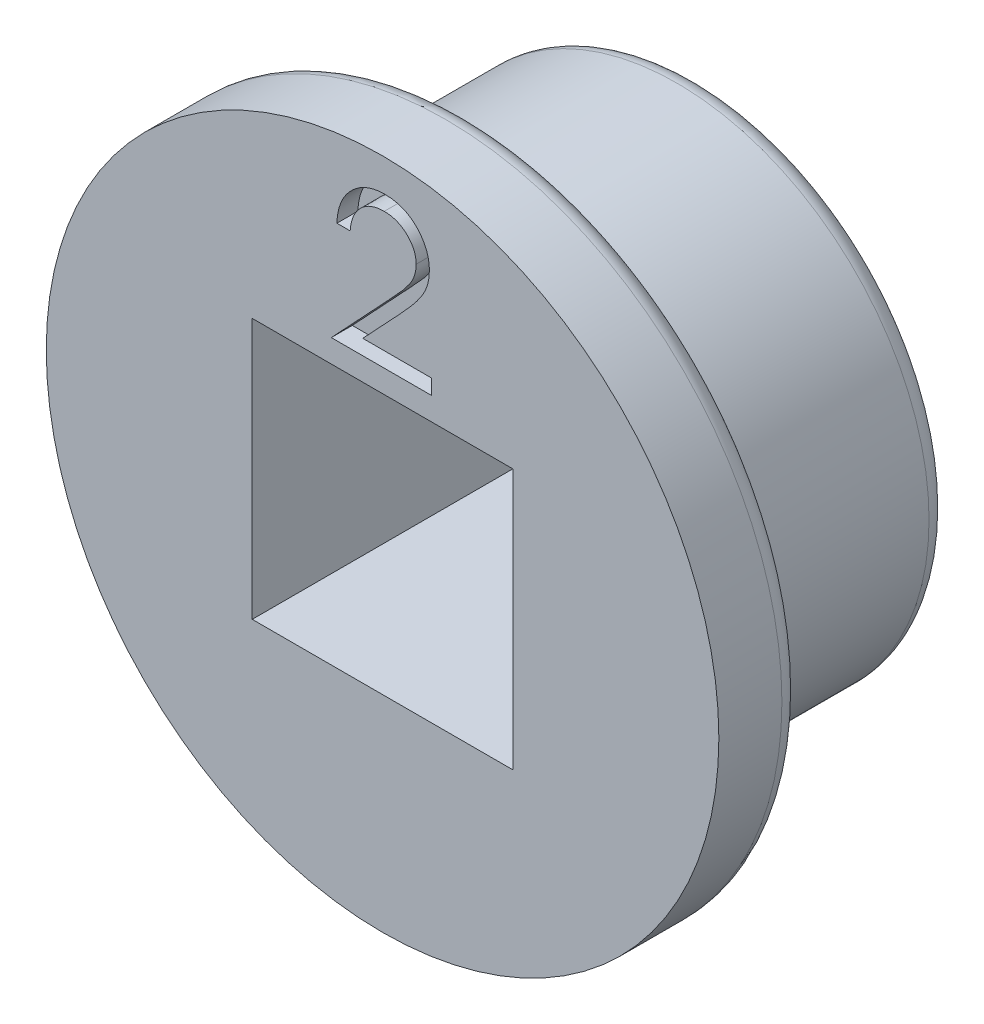
ISO-10303-21;
HEADER;
FILE_DESCRIPTION(('STEP AP214'),'2;1');
FILE_NAME('part.step','',(''),(''),'','','');
FILE_SCHEMA(('AUTOMOTIVE_DESIGN { 1 0 10303 214 1 1 1 1 }'));
ENDSEC;
DATA;
#1=APPLICATION_CONTEXT('core data for automotive mechanical design processes');
#2=APPLICATION_PROTOCOL_DEFINITION('international standard','automotive_design',2000,#1);
#3=PRODUCT_CONTEXT('',#1,'mechanical');
#4=PRODUCT('Part','Part','',(#3));
#5=PRODUCT_RELATED_PRODUCT_CATEGORY('part','',(#4));
#6=PRODUCT_DEFINITION_FORMATION('','',#4);
#7=PRODUCT_DEFINITION_CONTEXT('part definition',#1,'design');
#8=PRODUCT_DEFINITION('design','',#6,#7);
#9=PRODUCT_DEFINITION_SHAPE('','',#8);
#10=(LENGTH_UNIT() NAMED_UNIT(*) SI_UNIT(.MILLI.,.METRE.));
#11=(NAMED_UNIT(*) PLANE_ANGLE_UNIT() SI_UNIT($,.RADIAN.));
#12=(NAMED_UNIT(*) SI_UNIT($,.STERADIAN.) SOLID_ANGLE_UNIT());
#13=UNCERTAINTY_MEASURE_WITH_UNIT(LENGTH_MEASURE(1.E-05),#10,'distance_accuracy_value','');
#14=(GEOMETRIC_REPRESENTATION_CONTEXT(3) GLOBAL_UNCERTAINTY_ASSIGNED_CONTEXT((#13)) GLOBAL_UNIT_ASSIGNED_CONTEXT((#10,
#11,#12)) REPRESENTATION_CONTEXT('',''));
#15=CARTESIAN_POINT('',(0.,0.,0.));
#16=DIRECTION('',(0.,0.,1.));
#17=DIRECTION('',(1.,0.,0.));
#18=AXIS2_PLACEMENT_3D('',#15,#16,#17);
#19=CARTESIAN_POINT('',(0.,0.,2.));
#20=DIRECTION('',(0.,0.,1.));
#21=DIRECTION('',(1.,0.,0.));
#22=AXIS2_PLACEMENT_3D('',#19,#20,#21);
#23=PLANE('',#22);
#24=CARTESIAN_POINT('',(0.,0.,2.));
#25=DIRECTION('',(0.,0.,1.));
#26=DIRECTION('',(1.,0.,0.));
#27=AXIS2_PLACEMENT_3D('',#24,#25,#26);
#28=CIRCLE('',#27,8.);
#29=CARTESIAN_POINT('',(8.,0.,2.));
#30=VERTEX_POINT('',#29);
#31=EDGE_CURVE('E180',#30,#30,#28,.T.);
#32=ORIENTED_EDGE('',*,*,#31,.T.);
#33=EDGE_LOOP('',(#32));
#34=FACE_BOUND('',#33,.T.);
#35=DIRECTION('',(1.,0.,0.));
#36=VECTOR('',#35,1.);
#37=CARTESIAN_POINT('',(0.,3.1,2.));
#38=LINE('',#37,#36);
#39=CARTESIAN_POINT('',(-3.1,3.1,2.));
#40=VERTEX_POINT('',#39);
#41=CARTESIAN_POINT('',(3.1,3.1,2.));
#42=VERTEX_POINT('',#41);
#43=EDGE_CURVE('E186',#40,#42,#38,.T.);
#44=ORIENTED_EDGE('',*,*,#43,.T.);
#45=DIRECTION('',(0.,-1.,0.));
#46=VECTOR('',#45,1.);
#47=CARTESIAN_POINT('',(3.1,0.,2.));
#48=LINE('',#47,#46);
#49=CARTESIAN_POINT('',(3.1,-3.1,2.));
#50=VERTEX_POINT('',#49);
#51=EDGE_CURVE('E195',#42,#50,#48,.T.);
#52=ORIENTED_EDGE('',*,*,#51,.T.);
#53=DIRECTION('',(1.,0.,0.));
#54=VECTOR('',#53,1.);
#55=CARTESIAN_POINT('',(0.,-3.1,2.));
#56=LINE('',#55,#54);
#57=CARTESIAN_POINT('',(-3.1,-3.1,2.));
#58=VERTEX_POINT('',#57);
#59=EDGE_CURVE('E199',#58,#50,#56,.T.);
#60=ORIENTED_EDGE('',*,*,#59,.F.);
#61=DIRECTION('',(0.,-1.,0.));
#62=VECTOR('',#61,1.);
#63=CARTESIAN_POINT('',(-3.1,0.,2.));
#64=LINE('',#63,#62);
#65=EDGE_CURVE('E203',#40,#58,#64,.T.);
#66=ORIENTED_EDGE('',*,*,#65,.F.);
#67=EDGE_LOOP('',(#44,#52,#60,#66));
#68=FACE_BOUND('',#67,.T.);
#69=CARTESIAN_POINT('',(0.799536119088481,6.16609445920682,2.));
#70=CARTESIAN_POINT('',(0.798900376789061,6.18997585761763,2.));
#71=CARTESIAN_POINT('',(0.797647450797474,6.23704150797893,2.));
#72=CARTESIAN_POINT('',(0.786589753303671,6.30604726699755,2.));
#73=CARTESIAN_POINT('',(0.769879247209163,6.37261208081334,2.));
#74=CARTESIAN_POINT('',(0.74593398916123,6.43694069993118,2.));
#75=CARTESIAN_POINT('',(0.71432724907589,6.49838635199736,2.));
#76=CARTESIAN_POINT('',(0.675853869158293,6.55702383220096,2.));
#77=CARTESIAN_POINT('',(0.631463805740429,6.61371279740104,2.));
#78=CARTESIAN_POINT('',(0.58011253640956,6.66686609545911,2.));
#79=CARTESIAN_POINT('',(0.523701016602978,6.71554730094158,2.));
#80=CARTESIAN_POINT('',(0.464106767017747,6.75867138635594,2.));
#81=CARTESIAN_POINT('',(0.401056662757836,6.79471049715476,2.));
#82=CARTESIAN_POINT('',(0.334816540582015,6.82425399433519,2.));
#83=CARTESIAN_POINT('',(0.26557107117366,6.84742937553153,2.));
#84=CARTESIAN_POINT('',(0.193186326051267,6.86348795495464,2.));
#85=CARTESIAN_POINT('',(0.117862309768765,6.87357043890127,2.));
#86=CARTESIAN_POINT('',(0.0664288140781253,6.87493461080964,2.));
#87=CARTESIAN_POINT('',(0.0402212152423268,6.87562971561707,2.));
#88=B_SPLINE_CURVE_WITH_KNOTS('',3,(#69,#70,#71,#72,#73,#74,#75,#76,#77,#78,#79,#80,#81,#82,#83,
#84,#85,#86,#87),.UNSPECIFIED.,.F.,.F.,(4,1,1,1,1,1,1,1,1,1,1,1,1,1,1,1,4),(0.,
0.0619654006870618,0.122121905638295,0.180988496849841,0.239933216451902,0.299905831106524,
0.359988847476987,0.421775741741646,0.486575826421126,0.551534804619741,0.615017542759979,
0.677258616661657,0.739729962362713,0.803050102662951,0.866495132015698,0.931973474177149,1.),.UNSPECIFIED.);
#89=CARTESIAN_POINT('',(0.79953611908848,6.16609445920682,2.));
#90=VERTEX_POINT('',#89);
#91=CARTESIAN_POINT('',(0.0402212152423268,6.87562971561707,2.));
#92=VERTEX_POINT('',#91);
#93=EDGE_CURVE('E174',#90,#92,#88,.T.);
#94=ORIENTED_EDGE('',*,*,#93,.T.);
#95=CARTESIAN_POINT('',(0.0402212152423268,6.87562971561707,2.));
#96=CARTESIAN_POINT('',(0.0128503824860018,6.87491468335314,2.));
#97=CARTESIAN_POINT('',(-0.0409014137335572,6.87351047804878,2.));
#98=CARTESIAN_POINT('',(-0.119820446670097,6.86368781405675,2.));
#99=CARTESIAN_POINT('',(-0.195106224193959,6.84674197365982,2.));
#100=CARTESIAN_POINT('',(-0.266948127146877,6.8235652992728,2.));
#101=CARTESIAN_POINT('',(-0.335467712959603,6.79410675045047,2.));
#102=CARTESIAN_POINT('',(-0.400331756996927,6.7574150057717,2.));
#103=CARTESIAN_POINT('',(-0.461394646256844,6.71363151261916,2.));
#104=CARTESIAN_POINT('',(-0.518771169602337,6.66399095629512,2.));
#105=CARTESIAN_POINT('',(-0.571635148665881,6.60872335507919,2.));
#106=CARTESIAN_POINT('',(-0.618082024530801,6.54711339201225,2.));
#107=CARTESIAN_POINT('',(-0.658666038674432,6.48028597664115,2.));
#108=CARTESIAN_POINT('',(-0.694075272154231,6.4084214260718,2.));
#109=CARTESIAN_POINT('',(-0.722830962237,6.33086764608729,2.));
#110=CARTESIAN_POINT('',(-0.744804112668102,6.24789994123884,2.));
#111=CARTESIAN_POINT('',(-0.762190959389715,6.15987855980029,2.));
#112=CARTESIAN_POINT('',(-0.767999479994565,6.09909347494372,2.));
#113=CARTESIAN_POINT('',(-0.77097670142434,6.06793740792477,2.));
#114=B_SPLINE_CURVE_WITH_KNOTS('',3,(#95,#96,#97,#98,#99,#100,#101,#102,#103,#104,#105,#106,
#107,#108,#109,#110,#111,#112,#113),.UNSPECIFIED.,.F.,.F.,(4,1,1,1,1,1,1,1,1,1,1,1,1,1,1,1,4),
(0.,0.0644386715952429,0.126546911271678,0.186887153436571,0.245877535589455,0.304040884691267,
0.362191218072661,0.420975932791645,0.480660283279666,0.540600274953758,0.600689098349453,
0.661935789757196,0.724442505913982,0.789038393881744,0.856313757050995,0.926352028205864,1.),.UNSPECIFIED.);
#115=CARTESIAN_POINT('',(-0.77097670142434,6.06793740792477,2.));
#116=VERTEX_POINT('',#115);
#117=EDGE_CURVE('E57',#92,#116,#114,.T.);
#118=ORIENTED_EDGE('',*,*,#117,.T.);
#119=DIRECTION('',(-1.,0.,0.));
#120=VECTOR('',#119,1.);
#121=CARTESIAN_POINT('',(-0.77097670142434,6.06793740792477,2.));
#122=LINE('',#121,#120);
#123=CARTESIAN_POINT('',(-1.0850792655269,6.06793740792477,2.));
#124=VERTEX_POINT('',#123);
#125=EDGE_CURVE('E178',#116,#124,#122,.T.);
#126=ORIENTED_EDGE('',*,*,#125,.T.);
#127=CARTESIAN_POINT('',(-1.0850792655269,6.06793740792477,2.));
#128=CARTESIAN_POINT('',(-1.08303211251897,6.10960829569256,2.));
#129=CARTESIAN_POINT('',(-1.07901155849296,6.19144881026746,2.));
#130=CARTESIAN_POINT('',(-1.06018326923122,6.31077271666656,2.));
#131=CARTESIAN_POINT('',(-1.03324239202635,6.42482751539142,2.));
#132=CARTESIAN_POINT('',(-0.995150938011544,6.53269742936108,2.));
#133=CARTESIAN_POINT('',(-0.947844660241776,6.6353362365914,2.));
#134=CARTESIAN_POINT('',(-0.891114632860886,6.73233625228268,2.));
#135=CARTESIAN_POINT('',(-0.823920782347463,6.82332744099729,2.));
#136=CARTESIAN_POINT('',(-0.747714048302034,6.90746628429275,2.));
#137=CARTESIAN_POINT('',(-0.664945409247032,6.98465385509209,2.));
#138=CARTESIAN_POINT('',(-0.575639469775992,7.05130909789825,2.));
#139=CARTESIAN_POINT('',(-0.481794442489688,7.10762676926023,2.));
#140=CARTESIAN_POINT('',(-0.383695043524293,7.15470801108408,2.));
#141=CARTESIAN_POINT('',(-0.28023447996484,7.19004785700661,2.));
#142=CARTESIAN_POINT('',(-0.172351622125396,7.2162694966112,2.));
#143=CARTESIAN_POINT('',(-0.0595724857159585,7.23204584233277,2.));
#144=CARTESIAN_POINT('',(0.0172675363309748,7.23374162793707,2.));
#145=CARTESIAN_POINT('',(0.056347016524378,7.23460407459143,2.));
#146=B_SPLINE_CURVE_WITH_KNOTS('',3,(#127,#128,#129,#130,#131,#132,#133,#134,#135,#136,#137,
#138,#139,#140,#141,#142,#143,#144,#145),.UNSPECIFIED.,.F.,.F.,(4,1,1,1,1,1,1,1,1,1,1,1,1,1,1,1,
4),(0.,0.0687907943906179,0.135103289431127,0.198978674310651,0.261904299780856,
0.323494969367969,0.385195377966051,0.446969238740774,0.509764776703132,0.572250568847368,
0.633405175661153,0.693251162921753,0.75258316278567,0.812579266153421,0.873275084920192,
0.935549942895029,1.),.UNSPECIFIED.);
#147=CARTESIAN_POINT('',(0.056347016524378,7.23460407459143,2.));
#148=VERTEX_POINT('',#147);
#149=EDGE_CURVE('E362',#124,#148,#146,.T.);
#150=ORIENTED_EDGE('',*,*,#149,.T.);
#151=CARTESIAN_POINT('',(0.056347016524378,7.23460407459143,2.));
#152=CARTESIAN_POINT('',(0.094725090611721,7.233705618146,2.));
#153=CARTESIAN_POINT('',(0.170136635268132,7.23194018332502,2.));
#154=CARTESIAN_POINT('',(0.280198649721017,7.21677915405779,2.));
#155=CARTESIAN_POINT('',(0.384975944184401,7.1930335624225,2.));
#156=CARTESIAN_POINT('',(0.484263710706301,7.1597181461092,2.));
#157=CARTESIAN_POINT('',(0.577269775277551,7.11493371871667,2.));
#158=CARTESIAN_POINT('',(0.664692819833899,7.06113618005852,2.));
#159=CARTESIAN_POINT('',(0.7475736306249,6.99891634868636,2.));
#160=CARTESIAN_POINT('',(0.822180414237061,6.92566253523797,2.));
#161=CARTESIAN_POINT('',(0.890688493473317,6.8474601507676,2.));
#162=CARTESIAN_POINT('',(0.949790748617592,6.76397224715545,2.));
#163=CARTESIAN_POINT('',(1.00040391209092,6.67774296144043,2.));
#164=CARTESIAN_POINT('',(1.0425915919721,6.58811475985893,2.));
#165=CARTESIAN_POINT('',(1.07364773091123,6.49424373144623,2.));
#166=CARTESIAN_POINT('',(1.0972259389406,6.39749652865459,2.));
#167=CARTESIAN_POINT('',(1.11055335262869,6.29687171764802,2.));
#168=CARTESIAN_POINT('',(1.11259877612654,6.22876516200028,2.));
#169=CARTESIAN_POINT('',(1.11363868319104,6.19413933100169,2.));
#170=B_SPLINE_CURVE_WITH_KNOTS('',3,(#151,#152,#153,#154,#155,#156,#157,#158,#159,#160,#161,
#162,#163,#164,#165,#166,#167,#168,#169),.UNSPECIFIED.,.F.,.F.,(4,1,1,1,1,1,1,1,1,1,1,1,1,1,1,1,
4),(0.,0.0694754602496704,0.136516797617799,0.200788823609261,0.263829672855826,
0.32573502296542,0.387290692215291,0.449509218762603,0.512967819545442,0.576275215493061,
0.637580100263925,0.697902605917102,0.757172088426985,0.816598528488656,0.87665317089282,
0.937289642410241,1.),.UNSPECIFIED.);
#171=CARTESIAN_POINT('',(1.11363868319104,6.19413933100169,2.));
#172=VERTEX_POINT('',#171);
#173=EDGE_CURVE('E365',#148,#172,#170,.T.);
#174=ORIENTED_EDGE('',*,*,#173,.T.);
#175=CARTESIAN_POINT('',(1.11363868319104,6.19413933100169,2.));
#176=CARTESIAN_POINT('',(1.11194542033456,6.14539149642686,2.));
#177=CARTESIAN_POINT('',(1.10858860898739,6.04875128275634,2.));
#178=CARTESIAN_POINT('',(1.07987423241998,5.90673642000715,2.));
#179=CARTESIAN_POINT('',(1.03502772132452,5.76914300092048,2.));
#180=CARTESIAN_POINT('',(0.981030364475177,5.65840569883603,2.));
#181=CARTESIAN_POINT('',(0.926557920413495,5.569172205079,2.));
#182=CARTESIAN_POINT('',(0.877470412819851,5.49570350015926,2.));
#183=CARTESIAN_POINT('',(0.820005601798043,5.41659803176986,2.));
#184=CARTESIAN_POINT('',(0.753327103835355,5.33212069439591,2.));
#185=CARTESIAN_POINT('',(0.678814231684619,5.24160978929735,2.));
#186=CARTESIAN_POINT('',(0.595792068327983,5.14511999389894,2.));
#187=CARTESIAN_POINT('',(0.503668586306585,5.04364822407889,2.));
#188=CARTESIAN_POINT('',(0.439010085552245,4.97434262269106,2.));
#189=CARTESIAN_POINT('',(0.405505670370532,4.9384301963863,2.));
#190=B_SPLINE_CURVE_WITH_KNOTS('',3,(#175,#176,#177,#178,#179,#180,#181,#182,#183,#184,#185,
#186,#187,#188,#189),.UNSPECIFIED.,.F.,.F.,(4,1,1,1,1,1,1,1,1,1,1,1,4),(0.,0.0987021963061532,
0.195672308810664,0.292422426507954,0.391342543799825,0.444462440671892,0.504228775449316,
0.570352337994678,0.642545753097748,0.722287505344019,0.807921122682712,0.900469537985015,1.),.UNSPECIFIED.);
#191=CARTESIAN_POINT('',(0.405505670370532,4.9384301963863,2.));
#192=VERTEX_POINT('',#191);
#193=EDGE_CURVE('E371',#172,#192,#190,.T.);
#194=ORIENTED_EDGE('',*,*,#193,.T.);
#195=DIRECTION('',(-0.683740795861405,-0.729724964678345,0.));
#196=VECTOR('',#195,1.);
#197=CARTESIAN_POINT('',(0.405505670370532,4.9384301963863,2.));
#198=LINE('',#197,#196);
#199=CARTESIAN_POINT('',(-0.47019545142434,4.0038348438222,2.));
#200=VERTEX_POINT('',#199);
#201=EDGE_CURVE('E393',#192,#200,#198,.T.);
#202=ORIENTED_EDGE('',*,*,#201,.T.);
#203=DIRECTION('',(1.,0.,0.));
#204=VECTOR('',#203,1.);
#205=CARTESIAN_POINT('',(-0.47019545142434,4.0038348438222,2.));
#206=LINE('',#205,#204);
#207=CARTESIAN_POINT('',(1.15851047806284,4.0038348438222,2.));
#208=VERTEX_POINT('',#207);
#209=EDGE_CURVE('E400',#200,#208,#206,.T.);
#210=ORIENTED_EDGE('',*,*,#209,.T.);
#211=DIRECTION('',(0.,-1.,0.));
#212=VECTOR('',#211,1.);
#213=CARTESIAN_POINT('',(1.15851047806284,4.0038348438222,2.));
#214=LINE('',#213,#212);
#215=CARTESIAN_POINT('',(1.15851047806284,3.64486048484784,2.));
#216=VERTEX_POINT('',#215);
#217=EDGE_CURVE('E404',#208,#216,#214,.T.);
#218=ORIENTED_EDGE('',*,*,#217,.T.);
#219=DIRECTION('',(-1.,0.,0.));
#220=VECTOR('',#219,1.);
#221=CARTESIAN_POINT('',(1.15851047806284,3.64486048484784,2.));
#222=LINE('',#221,#220);
#223=CARTESIAN_POINT('',(-1.21969465014229,3.64486048484784,2.));
#224=VERTEX_POINT('',#223);
#225=EDGE_CURVE('E408',#216,#224,#222,.T.);
#226=ORIENTED_EDGE('',*,*,#225,.T.);
#227=DIRECTION('',(0.683776631973393,0.729691385153424,0.));
#228=VECTOR('',#227,1.);
#229=CARTESIAN_POINT('',(-1.21969465014229,3.64486048484784,2.));
#230=LINE('',#229,#228);
#231=CARTESIAN_POINT('',(0.137677144729506,5.09337811305297,2.));
#232=VERTEX_POINT('',#231);
#233=EDGE_CURVE('E318',#224,#232,#230,.T.);
#234=ORIENTED_EDGE('',*,*,#233,.T.);
#235=CARTESIAN_POINT('',(0.137677144729506,5.09337811305297,2.));
#236=CARTESIAN_POINT('',(0.170725031537361,5.12787641960158,2.));
#237=CARTESIAN_POINT('',(0.234203258656264,5.19414060620578,2.));
#238=CARTESIAN_POINT('',(0.323985835465464,5.2908835663398,2.));
#239=CARTESIAN_POINT('',(0.404624823777869,5.38063310709192,2.));
#240=CARTESIAN_POINT('',(0.476642216549692,5.4632196555364,2.));
#241=CARTESIAN_POINT('',(0.538475721915515,5.53985122333192,2.));
#242=CARTESIAN_POINT('',(0.593347953863292,5.60804592691967,2.));
#243=CARTESIAN_POINT('',(0.637313544845364,5.67080037722758,2.));
#244=CARTESIAN_POINT('',(0.685028940533035,5.74354099114011,2.));
#245=CARTESIAN_POINT('',(0.731242921931261,5.83235330831417,2.));
#246=CARTESIAN_POINT('',(0.770955277971654,5.94088699757521,2.));
#247=CARTESIAN_POINT('',(0.795170126420277,6.0526142502512,2.));
#248=CARTESIAN_POINT('',(0.798074961926103,6.12811628729847,2.));
#249=CARTESIAN_POINT('',(0.79953611908848,6.16609445920682,2.));
#250=B_SPLINE_CURVE_WITH_KNOTS('',3,(#235,#236,#237,#238,#239,#240,#241,#242,#243,#244,#245,
#246,#247,#248,#249),.UNSPECIFIED.,.F.,.F.,(4,1,1,1,1,1,1,1,1,1,1,1,4),(0.,0.110802643801319,
0.21282920234777,0.306101309823111,0.39064732111601,0.466924469360852,0.534481039284031,
0.593586940965672,0.644557004508717,0.736200452629373,0.825024025618864,0.911985584829758,1.),.UNSPECIFIED.);
#251=EDGE_CURVE('E312',#232,#90,#250,.T.);
#252=ORIENTED_EDGE('',*,*,#251,.T.);
#253=EDGE_LOOP('',(#94,#118,#126,#150,#174,#194,#202,#210,#218,#226,#234,#252));
#254=FACE_BOUND('',#253,.T.);
#255=ADVANCED_FACE('F41',(#34,#68,#254),#23,.T.);
#256=CARTESIAN_POINT('',(0.,3.1,-5.5));
#257=DIRECTION('',(0.,-1.,0.));
#258=DIRECTION('',(0.,0.,-1.));
#259=AXIS2_PLACEMENT_3D('',#256,#257,#258);
#260=PLANE('',#259);
#261=DIRECTION('',(0.,0.,1.));
#262=VECTOR('',#261,1.);
#263=CARTESIAN_POINT('',(3.1,3.1,-5.5));
#264=LINE('',#263,#262);
#265=CARTESIAN_POINT('',(3.1,3.1,-5.5));
#266=VERTEX_POINT('',#265);
#267=EDGE_CURVE('E221',#266,#42,#264,.T.);
#268=ORIENTED_EDGE('',*,*,#267,.T.);
#269=ORIENTED_EDGE('',*,*,#43,.F.);
#270=DIRECTION('',(0.,0.,1.));
#271=VECTOR('',#270,1.);
#272=CARTESIAN_POINT('',(-3.1,3.1,-5.5));
#273=LINE('',#272,#271);
#274=CARTESIAN_POINT('',(-3.1,3.1,-5.5));
#275=VERTEX_POINT('',#274);
#276=EDGE_CURVE('E65',#275,#40,#273,.T.);
#277=ORIENTED_EDGE('',*,*,#276,.F.);
#278=DIRECTION('',(1.,0.,0.));
#279=VECTOR('',#278,1.);
#280=CARTESIAN_POINT('',(0.,3.1,-5.5));
#281=LINE('',#280,#279);
#282=EDGE_CURVE('E208',#275,#266,#281,.T.);
#283=ORIENTED_EDGE('',*,*,#282,.T.);
#284=EDGE_LOOP('',(#268,#269,#277,#283));
#285=FACE_BOUND('',#284,.T.);
#286=ADVANCED_FACE('F261',(#285),#260,.T.);
#287=CARTESIAN_POINT('',(-3.1,0.,-5.5));
#288=DIRECTION('',(-1.,0.,0.));
#289=DIRECTION('',(0.,0.,1.));
#290=AXIS2_PLACEMENT_3D('',#287,#288,#289);
#291=PLANE('',#290);
#292=ORIENTED_EDGE('',*,*,#276,.T.);
#293=ORIENTED_EDGE('',*,*,#65,.T.);
#294=DIRECTION('',(0.,0.,1.));
#295=VECTOR('',#294,1.);
#296=CARTESIAN_POINT('',(-3.1,-3.1,-5.5));
#297=LINE('',#296,#295);
#298=CARTESIAN_POINT('',(-3.1,-3.1,-5.5));
#299=VERTEX_POINT('',#298);
#300=EDGE_CURVE('E228',#299,#58,#297,.T.);
#301=ORIENTED_EDGE('',*,*,#300,.F.);
#302=DIRECTION('',(0.,-1.,0.));
#303=VECTOR('',#302,1.);
#304=CARTESIAN_POINT('',(-3.1,0.,-5.5));
#305=LINE('',#304,#303);
#306=EDGE_CURVE('E218',#275,#299,#305,.T.);
#307=ORIENTED_EDGE('',*,*,#306,.F.);
#308=EDGE_LOOP('',(#292,#293,#301,#307));
#309=FACE_BOUND('',#308,.T.);
#310=ADVANCED_FACE('F267',(#309),#291,.F.);
#311=CARTESIAN_POINT('',(0.,-3.1,-5.5));
#312=DIRECTION('',(0.,-1.,0.));
#313=DIRECTION('',(0.,0.,-1.));
#314=AXIS2_PLACEMENT_3D('',#311,#312,#313);
#315=PLANE('',#314);
#316=ORIENTED_EDGE('',*,*,#300,.T.);
#317=ORIENTED_EDGE('',*,*,#59,.T.);
#318=DIRECTION('',(0.,0.,1.));
#319=VECTOR('',#318,1.);
#320=CARTESIAN_POINT('',(3.1,-3.1,-5.5));
#321=LINE('',#320,#319);
#322=CARTESIAN_POINT('',(3.1,-3.1,-5.5));
#323=VERTEX_POINT('',#322);
#324=EDGE_CURVE('E231',#323,#50,#321,.T.);
#325=ORIENTED_EDGE('',*,*,#324,.F.);
#326=DIRECTION('',(1.,0.,0.));
#327=VECTOR('',#326,1.);
#328=CARTESIAN_POINT('',(0.,-3.1,-5.5));
#329=LINE('',#328,#327);
#330=EDGE_CURVE('E215',#299,#323,#329,.T.);
#331=ORIENTED_EDGE('',*,*,#330,.F.);
#332=EDGE_LOOP('',(#316,#317,#325,#331));
#333=FACE_BOUND('',#332,.T.);
#334=ADVANCED_FACE('F288',(#333),#315,.F.);
#335=CARTESIAN_POINT('',(3.1,0.,-5.5));
#336=DIRECTION('',(-1.,0.,0.));
#337=DIRECTION('',(0.,0.,1.));
#338=AXIS2_PLACEMENT_3D('',#335,#336,#337);
#339=PLANE('',#338);
#340=ORIENTED_EDGE('',*,*,#324,.T.);
#341=ORIENTED_EDGE('',*,*,#51,.F.);
#342=ORIENTED_EDGE('',*,*,#267,.F.);
#343=DIRECTION('',(0.,-1.,0.));
#344=VECTOR('',#343,1.);
#345=CARTESIAN_POINT('',(3.1,0.,-5.5));
#346=LINE('',#345,#344);
#347=EDGE_CURVE('E211',#266,#323,#346,.T.);
#348=ORIENTED_EDGE('',*,*,#347,.T.);
#349=EDGE_LOOP('',(#340,#341,#342,#348));
#350=FACE_BOUND('',#349,.T.);
#351=ADVANCED_FACE('F285',(#350),#339,.T.);
#352=CARTESIAN_POINT('',(0.,0.,-5.5));
#353=DIRECTION('',(0.,0.,1.));
#354=DIRECTION('',(1.,0.,0.));
#355=AXIS2_PLACEMENT_3D('',#352,#353,#354);
#356=CYLINDRICAL_SURFACE('',#355,6.);
#357=CARTESIAN_POINT('',(0.,0.,-5.));
#358=DIRECTION('',(0.,0.,1.));
#359=DIRECTION('',(1.,0.,0.));
#360=AXIS2_PLACEMENT_3D('',#357,#358,#359);
#361=CIRCLE('',#360,6.);
#362=CARTESIAN_POINT('',(6.,0.,-5.));
#363=VERTEX_POINT('',#362);
#364=EDGE_CURVE('E50',#363,#363,#361,.T.);
#365=ORIENTED_EDGE('',*,*,#364,.T.);
#366=EDGE_LOOP('',(#365));
#367=FACE_BOUND('',#366,.T.);
#368=CARTESIAN_POINT('',(0.,0.,0.));
#369=DIRECTION('',(0.,0.,1.));
#370=DIRECTION('',(1.,0.,0.));
#371=AXIS2_PLACEMENT_3D('',#368,#369,#370);
#372=CIRCLE('',#371,6.);
#373=CARTESIAN_POINT('',(6.,0.,0.));
#374=VERTEX_POINT('',#373);
#375=EDGE_CURVE('E207',#374,#374,#372,.T.);
#376=ORIENTED_EDGE('',*,*,#375,.F.);
#377=EDGE_LOOP('',(#376));
#378=FACE_BOUND('',#377,.T.);
#379=ADVANCED_FACE('F246',(#367,#378),#356,.T.);
#380=CARTESIAN_POINT('',(0.,0.,-5.5));
#381=DIRECTION('',(0.,0.,1.));
#382=DIRECTION('',(1.,0.,0.));
#383=AXIS2_PLACEMENT_3D('',#380,#381,#382);
#384=PLANE('',#383);
#385=CARTESIAN_POINT('',(0.,0.,-5.5));
#386=DIRECTION('',(0.,0.,1.));
#387=DIRECTION('',(1.,0.,0.));
#388=AXIS2_PLACEMENT_3D('',#385,#386,#387);
#389=CIRCLE('',#388,5.5);
#390=CARTESIAN_POINT('',(5.5,0.,-5.5));
#391=VERTEX_POINT('',#390);
#392=EDGE_CURVE('E11',#391,#391,#389,.F.);
#393=ORIENTED_EDGE('',*,*,#392,.T.);
#394=EDGE_LOOP('',(#393));
#395=FACE_BOUND('',#394,.T.);
#396=ORIENTED_EDGE('',*,*,#282,.F.);
#397=ORIENTED_EDGE('',*,*,#306,.T.);
#398=ORIENTED_EDGE('',*,*,#330,.T.);
#399=ORIENTED_EDGE('',*,*,#347,.F.);
#400=EDGE_LOOP('',(#396,#397,#398,#399));
#401=FACE_BOUND('',#400,.T.);
#402=ADVANCED_FACE('F278',(#395,#401),#384,.F.);
#403=CARTESIAN_POINT('',(0.,0.,2.));
#404=DIRECTION('',(0.,0.,-1.));
#405=DIRECTION('',(-1.,0.,0.));
#406=AXIS2_PLACEMENT_3D('',#403,#404,#405);
#407=CYLINDRICAL_SURFACE('',#406,8.);
#408=CARTESIAN_POINT('',(0.,0.,0.5));
#409=DIRECTION('',(0.,0.,1.));
#410=DIRECTION('',(1.,0.,0.));
#411=AXIS2_PLACEMENT_3D('',#408,#409,#410);
#412=CIRCLE('',#411,8.);
#413=CARTESIAN_POINT('',(8.,0.,0.5));
#414=VERTEX_POINT('',#413);
#415=EDGE_CURVE('E227',#414,#414,#412,.T.);
#416=ORIENTED_EDGE('',*,*,#415,.T.);
#417=EDGE_LOOP('',(#416));
#418=FACE_BOUND('',#417,.T.);
#419=ORIENTED_EDGE('',*,*,#31,.F.);
#420=EDGE_LOOP('',(#419));
#421=FACE_BOUND('',#420,.T.);
#422=ADVANCED_FACE('F274',(#418,#421),#407,.T.);
#423=CARTESIAN_POINT('',(0.,0.,0.));
#424=DIRECTION('',(0.,0.,1.));
#425=DIRECTION('',(1.,0.,0.));
#426=AXIS2_PLACEMENT_3D('',#423,#424,#425);
#427=PLANE('',#426);
#428=CARTESIAN_POINT('',(0.,0.,0.));
#429=DIRECTION('',(0.,0.,1.));
#430=DIRECTION('',(1.,0.,0.));
#431=AXIS2_PLACEMENT_3D('',#428,#429,#430);
#432=CIRCLE('',#431,7.5);
#433=CARTESIAN_POINT('',(7.5,0.,0.));
#434=VERTEX_POINT('',#433);
#435=EDGE_CURVE('E239',#434,#434,#432,.F.);
#436=ORIENTED_EDGE('',*,*,#435,.T.);
#437=EDGE_LOOP('',(#436));
#438=FACE_BOUND('',#437,.T.);
#439=ORIENTED_EDGE('',*,*,#375,.T.);
#440=EDGE_LOOP('',(#439));
#441=FACE_BOUND('',#440,.T.);
#442=ADVANCED_FACE('F257',(#438,#441),#427,.F.);
#443=CARTESIAN_POINT('',(0.,0.,0.5));
#444=DIRECTION('',(0.,0.,1.));
#445=DIRECTION('',(1.,0.,0.));
#446=AXIS2_PLACEMENT_3D('',#443,#444,#445);
#447=TOROIDAL_SURFACE('',#446,7.5,0.5);
#448=ORIENTED_EDGE('',*,*,#435,.F.);
#449=EDGE_LOOP('',(#448));
#450=FACE_BOUND('',#449,.T.);
#451=ORIENTED_EDGE('',*,*,#415,.F.);
#452=EDGE_LOOP('',(#451));
#453=FACE_BOUND('',#452,.T.);
#454=ADVANCED_FACE('F250',(#450,#453),#447,.T.);
#455=CARTESIAN_POINT('',(0.,0.,-5.));
#456=DIRECTION('',(0.,0.,1.));
#457=DIRECTION('',(1.,0.,0.));
#458=AXIS2_PLACEMENT_3D('',#455,#456,#457);
#459=TOROIDAL_SURFACE('',#458,5.5,0.5);
#460=ORIENTED_EDGE('',*,*,#392,.F.);
#461=EDGE_LOOP('',(#460));
#462=FACE_BOUND('',#461,.T.);
#463=ORIENTED_EDGE('',*,*,#364,.F.);
#464=EDGE_LOOP('',(#463));
#465=FACE_BOUND('',#464,.T.);
#466=ADVANCED_FACE('F43',(#462,#465),#459,.T.);
#467=CARTESIAN_POINT('',(0.0402212152423268,6.87562971561707,1.5));
#468=CARTESIAN_POINT('',(0.0128503824860018,6.87491468335314,1.5));
#469=CARTESIAN_POINT('',(-0.0409014137335572,6.87351047804878,1.5));
#470=CARTESIAN_POINT('',(-0.119820446670097,6.86368781405675,1.5));
#471=CARTESIAN_POINT('',(-0.195106224193959,6.84674197365982,1.5));
#472=CARTESIAN_POINT('',(-0.266948127146877,6.8235652992728,1.5));
#473=CARTESIAN_POINT('',(-0.335467712959603,6.79410675045047,1.5));
#474=CARTESIAN_POINT('',(-0.400331756996927,6.7574150057717,1.5));
#475=CARTESIAN_POINT('',(-0.461394646256844,6.71363151261916,1.5));
#476=CARTESIAN_POINT('',(-0.518771169602337,6.66399095629512,1.5));
#477=CARTESIAN_POINT('',(-0.571635148665881,6.60872335507919,1.5));
#478=CARTESIAN_POINT('',(-0.618082024530801,6.54711339201225,1.5));
#479=CARTESIAN_POINT('',(-0.658666038674432,6.48028597664115,1.5));
#480=CARTESIAN_POINT('',(-0.694075272154231,6.4084214260718,1.5));
#481=CARTESIAN_POINT('',(-0.722830962237,6.33086764608729,1.5));
#482=CARTESIAN_POINT('',(-0.744804112668102,6.24789994123884,1.5));
#483=CARTESIAN_POINT('',(-0.762190959389715,6.15987855980029,1.5));
#484=CARTESIAN_POINT('',(-0.767999479994565,6.09909347494372,1.5));
#485=CARTESIAN_POINT('',(-0.77097670142434,6.06793740792477,1.5));
#486=B_SPLINE_CURVE_WITH_KNOTS('',3,(#467,#468,#469,#470,#471,#472,#473,#474,#475,#476,#477,
#478,#479,#480,#481,#482,#483,#484,#485),.UNSPECIFIED.,.F.,.F.,(4,1,1,1,1,1,1,1,1,1,1,1,1,1,1,1,
4),(0.,0.0644386715952429,0.126546911271678,0.186887153436571,0.245877535589455,
0.304040884691267,0.362191218072661,0.420975932791645,0.480660283279666,0.540600274953758,
0.600689098349453,0.661935789757196,0.724442505913982,0.789038393881744,0.856313757050995,
0.926352028205864,1.),.UNSPECIFIED.);
#487=DIRECTION('',(0.,0.,1.));
#488=VECTOR('',#487,1.);
#489=SURFACE_OF_LINEAR_EXTRUSION('',#486,#488);
#490=ORIENTED_EDGE('',*,*,#117,.F.);
#491=DIRECTION('',(0.,0.,1.));
#492=VECTOR('',#491,1.);
#493=CARTESIAN_POINT('',(0.0402212152423268,6.87562971561707,1.5));
#494=LINE('',#493,#492);
#495=CARTESIAN_POINT('',(0.0402212152423268,6.87562971561707,1.5));
#496=VERTEX_POINT('',#495);
#497=EDGE_CURVE('E172',#496,#92,#494,.T.);
#498=ORIENTED_EDGE('',*,*,#497,.F.);
#499=CARTESIAN_POINT('',(-0.77097670142434,6.06793740792477,1.5));
#500=VERTEX_POINT('',#499);
#501=EDGE_CURVE('E162',#496,#500,#486,.T.);
#502=ORIENTED_EDGE('',*,*,#501,.T.);
#503=DIRECTION('',(0.,0.,1.));
#504=VECTOR('',#503,1.);
#505=CARTESIAN_POINT('',(-0.77097670142434,6.06793740792477,1.5));
#506=LINE('',#505,#504);
#507=EDGE_CURVE('E171',#500,#116,#506,.T.);
#508=ORIENTED_EDGE('',*,*,#507,.T.);
#509=EDGE_LOOP('',(#490,#498,#502,#508));
#510=FACE_BOUND('',#509,.T.);
#511=ADVANCED_FACE('F170',(#510),#489,.T.);
#512=CARTESIAN_POINT('',(-0.77097670142434,6.06793740792477,1.5));
#513=DIRECTION('',(0.,1.,0.));
#514=DIRECTION('',(0.,0.,1.));
#515=AXIS2_PLACEMENT_3D('',#512,#513,#514);
#516=PLANE('',#515);
#517=ORIENTED_EDGE('',*,*,#125,.F.);
#518=ORIENTED_EDGE('',*,*,#507,.F.);
#519=DIRECTION('',(-1.,0.,0.));
#520=VECTOR('',#519,1.);
#521=CARTESIAN_POINT('',(-0.77097670142434,6.06793740792477,1.5));
#522=LINE('',#521,#520);
#523=CARTESIAN_POINT('',(-1.0850792655269,6.06793740792477,1.5));
#524=VERTEX_POINT('',#523);
#525=EDGE_CURVE('E158',#500,#524,#522,.T.);
#526=ORIENTED_EDGE('',*,*,#525,.T.);
#527=DIRECTION('',(0.,0.,1.));
#528=VECTOR('',#527,1.);
#529=CARTESIAN_POINT('',(-1.0850792655269,6.06793740792477,1.5));
#530=LINE('',#529,#528);
#531=EDGE_CURVE('E181',#524,#124,#530,.T.);
#532=ORIENTED_EDGE('',*,*,#531,.T.);
#533=EDGE_LOOP('',(#517,#518,#526,#532));
#534=FACE_BOUND('',#533,.T.);
#535=ADVANCED_FACE('F176',(#534),#516,.T.);
#536=CARTESIAN_POINT('',(-1.0850792655269,6.06793740792477,1.5));
#537=CARTESIAN_POINT('',(-1.08303211251897,6.10960829569256,1.5));
#538=CARTESIAN_POINT('',(-1.07901155849296,6.19144881026746,1.5));
#539=CARTESIAN_POINT('',(-1.06018326923122,6.31077271666656,1.5));
#540=CARTESIAN_POINT('',(-1.03324239202635,6.42482751539142,1.5));
#541=CARTESIAN_POINT('',(-0.995150938011544,6.53269742936108,1.5));
#542=CARTESIAN_POINT('',(-0.947844660241776,6.6353362365914,1.5));
#543=CARTESIAN_POINT('',(-0.891114632860886,6.73233625228268,1.5));
#544=CARTESIAN_POINT('',(-0.823920782347463,6.82332744099729,1.5));
#545=CARTESIAN_POINT('',(-0.747714048302034,6.90746628429275,1.5));
#546=CARTESIAN_POINT('',(-0.664945409247032,6.98465385509209,1.5));
#547=CARTESIAN_POINT('',(-0.575639469775992,7.05130909789825,1.5));
#548=CARTESIAN_POINT('',(-0.481794442489688,7.10762676926023,1.5));
#549=CARTESIAN_POINT('',(-0.383695043524293,7.15470801108408,1.5));
#550=CARTESIAN_POINT('',(-0.28023447996484,7.19004785700661,1.5));
#551=CARTESIAN_POINT('',(-0.172351622125396,7.2162694966112,1.5));
#552=CARTESIAN_POINT('',(-0.0595724857159585,7.23204584233277,1.5));
#553=CARTESIAN_POINT('',(0.0172675363309748,7.23374162793707,1.5));
#554=CARTESIAN_POINT('',(0.056347016524378,7.23460407459143,1.5));
#555=B_SPLINE_CURVE_WITH_KNOTS('',3,(#536,#537,#538,#539,#540,#541,#542,#543,#544,#545,#546,
#547,#548,#549,#550,#551,#552,#553,#554),.UNSPECIFIED.,.F.,.F.,(4,1,1,1,1,1,1,1,1,1,1,1,1,1,1,1,
4),(0.,0.0687907943906179,0.135103289431127,0.198978674310651,0.261904299780856,
0.323494969367969,0.385195377966051,0.446969238740774,0.509764776703132,0.572250568847368,
0.633405175661153,0.693251162921753,0.75258316278567,0.812579266153421,0.873275084920192,
0.935549942895029,1.),.UNSPECIFIED.);
#556=DIRECTION('',(0.,0.,1.));
#557=VECTOR('',#556,1.);
#558=SURFACE_OF_LINEAR_EXTRUSION('',#555,#557);
#559=ORIENTED_EDGE('',*,*,#149,.F.);
#560=ORIENTED_EDGE('',*,*,#531,.F.);
#561=CARTESIAN_POINT('',(0.056347016524378,7.23460407459143,1.5));
#562=VERTEX_POINT('',#561);
#563=EDGE_CURVE('E164',#524,#562,#555,.T.);
#564=ORIENTED_EDGE('',*,*,#563,.T.);
#565=DIRECTION('',(0.,0.,1.));
#566=VECTOR('',#565,1.);
#567=CARTESIAN_POINT('',(0.056347016524378,7.23460407459143,1.5));
#568=LINE('',#567,#566);
#569=EDGE_CURVE('E188',#562,#148,#568,.T.);
#570=ORIENTED_EDGE('',*,*,#569,.T.);
#571=EDGE_LOOP('',(#559,#560,#564,#570));
#572=FACE_BOUND('',#571,.T.);
#573=ADVANCED_FACE('F360',(#572),#558,.T.);
#574=CARTESIAN_POINT('',(0.056347016524378,7.23460407459143,1.5));
#575=CARTESIAN_POINT('',(0.094725090611721,7.233705618146,1.5));
#576=CARTESIAN_POINT('',(0.170136635268132,7.23194018332502,1.5));
#577=CARTESIAN_POINT('',(0.280198649721017,7.21677915405779,1.5));
#578=CARTESIAN_POINT('',(0.384975944184401,7.1930335624225,1.5));
#579=CARTESIAN_POINT('',(0.484263710706301,7.1597181461092,1.5));
#580=CARTESIAN_POINT('',(0.577269775277551,7.11493371871667,1.5));
#581=CARTESIAN_POINT('',(0.664692819833899,7.06113618005852,1.5));
#582=CARTESIAN_POINT('',(0.7475736306249,6.99891634868636,1.5));
#583=CARTESIAN_POINT('',(0.822180414237061,6.92566253523797,1.5));
#584=CARTESIAN_POINT('',(0.890688493473317,6.8474601507676,1.5));
#585=CARTESIAN_POINT('',(0.949790748617592,6.76397224715545,1.5));
#586=CARTESIAN_POINT('',(1.00040391209092,6.67774296144043,1.5));
#587=CARTESIAN_POINT('',(1.0425915919721,6.58811475985893,1.5));
#588=CARTESIAN_POINT('',(1.07364773091123,6.49424373144623,1.5));
#589=CARTESIAN_POINT('',(1.0972259389406,6.39749652865459,1.5));
#590=CARTESIAN_POINT('',(1.11055335262869,6.29687171764802,1.5));
#591=CARTESIAN_POINT('',(1.11259877612654,6.22876516200028,1.5));
#592=CARTESIAN_POINT('',(1.11363868319104,6.19413933100169,1.5));
#593=B_SPLINE_CURVE_WITH_KNOTS('',3,(#574,#575,#576,#577,#578,#579,#580,#581,#582,#583,#584,
#585,#586,#587,#588,#589,#590,#591,#592),.UNSPECIFIED.,.F.,.F.,(4,1,1,1,1,1,1,1,1,1,1,1,1,1,1,1,
4),(0.,0.0694754602496704,0.136516797617799,0.200788823609261,0.263829672855826,
0.32573502296542,0.387290692215291,0.449509218762603,0.512967819545442,0.576275215493061,
0.637580100263925,0.697902605917102,0.757172088426985,0.816598528488656,0.87665317089282,
0.937289642410241,1.),.UNSPECIFIED.);
#594=DIRECTION('',(0.,0.,1.));
#595=VECTOR('',#594,1.);
#596=SURFACE_OF_LINEAR_EXTRUSION('',#593,#595);
#597=ORIENTED_EDGE('',*,*,#173,.F.);
#598=ORIENTED_EDGE('',*,*,#569,.F.);
#599=CARTESIAN_POINT('',(1.11363868319104,6.19413933100169,1.5));
#600=VERTEX_POINT('',#599);
#601=EDGE_CURVE('E479',#562,#600,#593,.T.);
#602=ORIENTED_EDGE('',*,*,#601,.T.);
#603=DIRECTION('',(0.,0.,1.));
#604=VECTOR('',#603,1.);
#605=CARTESIAN_POINT('',(1.11363868319104,6.19413933100169,1.5));
#606=LINE('',#605,#604);
#607=EDGE_CURVE('E353',#600,#172,#606,.T.);
#608=ORIENTED_EDGE('',*,*,#607,.T.);
#609=EDGE_LOOP('',(#597,#598,#602,#608));
#610=FACE_BOUND('',#609,.T.);
#611=ADVANCED_FACE('F366',(#610),#596,.T.);
#612=CARTESIAN_POINT('',(1.11363868319104,6.19413933100169,1.5));
#613=CARTESIAN_POINT('',(1.11194542033456,6.14539149642686,1.5));
#614=CARTESIAN_POINT('',(1.10858860898739,6.04875128275634,1.5));
#615=CARTESIAN_POINT('',(1.07987423241998,5.90673642000715,1.5));
#616=CARTESIAN_POINT('',(1.03502772132452,5.76914300092048,1.5));
#617=CARTESIAN_POINT('',(0.981030364475177,5.65840569883603,1.5));
#618=CARTESIAN_POINT('',(0.926557920413495,5.569172205079,1.5));
#619=CARTESIAN_POINT('',(0.877470412819851,5.49570350015926,1.5));
#620=CARTESIAN_POINT('',(0.820005601798043,5.41659803176986,1.5));
#621=CARTESIAN_POINT('',(0.753327103835355,5.33212069439591,1.5));
#622=CARTESIAN_POINT('',(0.678814231684619,5.24160978929735,1.5));
#623=CARTESIAN_POINT('',(0.595792068327983,5.14511999389894,1.5));
#624=CARTESIAN_POINT('',(0.503668586306585,5.04364822407889,1.5));
#625=CARTESIAN_POINT('',(0.439010085552245,4.97434262269106,1.5));
#626=CARTESIAN_POINT('',(0.405505670370532,4.9384301963863,1.5));
#627=B_SPLINE_CURVE_WITH_KNOTS('',3,(#612,#613,#614,#615,#616,#617,#618,#619,#620,#621,#622,
#623,#624,#625,#626),.UNSPECIFIED.,.F.,.F.,(4,1,1,1,1,1,1,1,1,1,1,1,4),(0.,0.0987021963061532,
0.195672308810664,0.292422426507954,0.391342543799825,0.444462440671892,0.504228775449316,
0.570352337994678,0.642545753097748,0.722287505344019,0.807921122682712,0.900469537985015,1.),.UNSPECIFIED.);
#628=DIRECTION('',(0.,0.,1.));
#629=VECTOR('',#628,1.);
#630=SURFACE_OF_LINEAR_EXTRUSION('',#627,#629);
#631=ORIENTED_EDGE('',*,*,#193,.F.);
#632=ORIENTED_EDGE('',*,*,#607,.F.);
#633=CARTESIAN_POINT('',(0.405505670370532,4.9384301963863,1.5));
#634=VERTEX_POINT('',#633);
#635=EDGE_CURVE('E472',#600,#634,#627,.T.);
#636=ORIENTED_EDGE('',*,*,#635,.T.);
#637=DIRECTION('',(0.,0.,1.));
#638=VECTOR('',#637,1.);
#639=CARTESIAN_POINT('',(0.405505670370532,4.9384301963863,1.5));
#640=LINE('',#639,#638);
#641=EDGE_CURVE('E350',#634,#192,#640,.T.);
#642=ORIENTED_EDGE('',*,*,#641,.T.);
#643=EDGE_LOOP('',(#631,#632,#636,#642));
#644=FACE_BOUND('',#643,.T.);
#645=ADVANCED_FACE('F464',(#644),#630,.T.);
#646=CARTESIAN_POINT('',(0.405505670370532,4.9384301963863,1.5));
#647=DIRECTION('',(-0.729724964678345,0.683740795861405,0.));
#648=DIRECTION('',(-0.683740795861405,-0.729724964678345,0.));
#649=AXIS2_PLACEMENT_3D('',#646,#647,#648);
#650=PLANE('',#649);
#651=ORIENTED_EDGE('',*,*,#201,.F.);
#652=ORIENTED_EDGE('',*,*,#641,.F.);
#653=DIRECTION('',(-0.683740795861405,-0.729724964678345,0.));
#654=VECTOR('',#653,1.);
#655=CARTESIAN_POINT('',(0.405505670370532,4.9384301963863,1.5));
#656=LINE('',#655,#654);
#657=CARTESIAN_POINT('',(-0.47019545142434,4.0038348438222,1.5));
#658=VERTEX_POINT('',#657);
#659=EDGE_CURVE('E478',#634,#658,#656,.T.);
#660=ORIENTED_EDGE('',*,*,#659,.T.);
#661=DIRECTION('',(0.,0.,1.));
#662=VECTOR('',#661,1.);
#663=CARTESIAN_POINT('',(-0.47019545142434,4.0038348438222,1.5));
#664=LINE('',#663,#662);
#665=EDGE_CURVE('E347',#658,#200,#664,.T.);
#666=ORIENTED_EDGE('',*,*,#665,.T.);
#667=EDGE_LOOP('',(#651,#652,#660,#666));
#668=FACE_BOUND('',#667,.T.);
#669=ADVANCED_FACE('F460',(#668),#650,.T.);
#670=CARTESIAN_POINT('',(-0.47019545142434,4.0038348438222,1.5));
#671=DIRECTION('',(0.,-1.,0.));
#672=DIRECTION('',(0.,0.,-1.));
#673=AXIS2_PLACEMENT_3D('',#670,#671,#672);
#674=PLANE('',#673);
#675=ORIENTED_EDGE('',*,*,#209,.F.);
#676=ORIENTED_EDGE('',*,*,#665,.F.);
#677=DIRECTION('',(1.,0.,0.));
#678=VECTOR('',#677,1.);
#679=CARTESIAN_POINT('',(-0.47019545142434,4.0038348438222,1.5));
#680=LINE('',#679,#678);
#681=CARTESIAN_POINT('',(1.15851047806284,4.0038348438222,1.5));
#682=VERTEX_POINT('',#681);
#683=EDGE_CURVE('E489',#658,#682,#680,.T.);
#684=ORIENTED_EDGE('',*,*,#683,.T.);
#685=DIRECTION('',(0.,0.,1.));
#686=VECTOR('',#685,1.);
#687=CARTESIAN_POINT('',(1.15851047806284,4.0038348438222,1.5));
#688=LINE('',#687,#686);
#689=EDGE_CURVE('E344',#682,#208,#688,.T.);
#690=ORIENTED_EDGE('',*,*,#689,.T.);
#691=EDGE_LOOP('',(#675,#676,#684,#690));
#692=FACE_BOUND('',#691,.T.);
#693=ADVANCED_FACE('F456',(#692),#674,.T.);
#694=CARTESIAN_POINT('',(1.15851047806284,4.0038348438222,1.5));
#695=DIRECTION('',(-1.,0.,0.));
#696=DIRECTION('',(0.,0.,1.));
#697=AXIS2_PLACEMENT_3D('',#694,#695,#696);
#698=PLANE('',#697);
#699=ORIENTED_EDGE('',*,*,#217,.F.);
#700=ORIENTED_EDGE('',*,*,#689,.F.);
#701=DIRECTION('',(0.,-1.,0.));
#702=VECTOR('',#701,1.);
#703=CARTESIAN_POINT('',(1.15851047806284,4.0038348438222,1.5));
#704=LINE('',#703,#702);
#705=CARTESIAN_POINT('',(1.15851047806284,3.64486048484784,1.5));
#706=VERTEX_POINT('',#705);
#707=EDGE_CURVE('E492',#682,#706,#704,.T.);
#708=ORIENTED_EDGE('',*,*,#707,.T.);
#709=DIRECTION('',(0.,0.,1.));
#710=VECTOR('',#709,1.);
#711=CARTESIAN_POINT('',(1.15851047806284,3.64486048484784,1.5));
#712=LINE('',#711,#710);
#713=EDGE_CURVE('E341',#706,#216,#712,.T.);
#714=ORIENTED_EDGE('',*,*,#713,.T.);
#715=EDGE_LOOP('',(#699,#700,#708,#714));
#716=FACE_BOUND('',#715,.T.);
#717=ADVANCED_FACE('F452',(#716),#698,.T.);
#718=CARTESIAN_POINT('',(1.15851047806284,3.64486048484784,1.5));
#719=DIRECTION('',(0.,1.,0.));
#720=DIRECTION('',(0.,0.,1.));
#721=AXIS2_PLACEMENT_3D('',#718,#719,#720);
#722=PLANE('',#721);
#723=ORIENTED_EDGE('',*,*,#225,.F.);
#724=ORIENTED_EDGE('',*,*,#713,.F.);
#725=DIRECTION('',(-1.,0.,0.));
#726=VECTOR('',#725,1.);
#727=CARTESIAN_POINT('',(1.15851047806284,3.64486048484784,1.5));
#728=LINE('',#727,#726);
#729=CARTESIAN_POINT('',(-1.21969465014229,3.64486048484784,1.5));
#730=VERTEX_POINT('',#729);
#731=EDGE_CURVE('E495',#706,#730,#728,.T.);
#732=ORIENTED_EDGE('',*,*,#731,.T.);
#733=DIRECTION('',(0.,0.,1.));
#734=VECTOR('',#733,1.);
#735=CARTESIAN_POINT('',(-1.21969465014229,3.64486048484784,1.5));
#736=LINE('',#735,#734);
#737=EDGE_CURVE('E338',#730,#224,#736,.T.);
#738=ORIENTED_EDGE('',*,*,#737,.T.);
#739=EDGE_LOOP('',(#723,#724,#732,#738));
#740=FACE_BOUND('',#739,.T.);
#741=ADVANCED_FACE('F449',(#740),#722,.T.);
#742=CARTESIAN_POINT('',(-1.21969465014229,3.64486048484784,1.5));
#743=DIRECTION('',(0.729691385153424,-0.683776631973393,0.));
#744=DIRECTION('',(0.683776631973393,0.729691385153424,0.));
#745=AXIS2_PLACEMENT_3D('',#742,#743,#744);
#746=PLANE('',#745);
#747=ORIENTED_EDGE('',*,*,#233,.F.);
#748=ORIENTED_EDGE('',*,*,#737,.F.);
#749=DIRECTION('',(0.683776631973393,0.729691385153424,0.));
#750=VECTOR('',#749,1.);
#751=CARTESIAN_POINT('',(-1.21969465014229,3.64486048484784,1.5));
#752=LINE('',#751,#750);
#753=CARTESIAN_POINT('',(0.137677144729506,5.09337811305297,1.5));
#754=VERTEX_POINT('',#753);
#755=EDGE_CURVE('E419',#730,#754,#752,.T.);
#756=ORIENTED_EDGE('',*,*,#755,.T.);
#757=DIRECTION('',(0.,0.,1.));
#758=VECTOR('',#757,1.);
#759=CARTESIAN_POINT('',(0.137677144729506,5.09337811305297,1.5));
#760=LINE('',#759,#758);
#761=EDGE_CURVE('E335',#754,#232,#760,.T.);
#762=ORIENTED_EDGE('',*,*,#761,.T.);
#763=EDGE_LOOP('',(#747,#748,#756,#762));
#764=FACE_BOUND('',#763,.T.);
#765=ADVANCED_FACE('F416',(#764),#746,.T.);
#766=CARTESIAN_POINT('',(0.137677144729506,5.09337811305297,1.5));
#767=CARTESIAN_POINT('',(0.170725031537361,5.12787641960158,1.5));
#768=CARTESIAN_POINT('',(0.234203258656264,5.19414060620578,1.5));
#769=CARTESIAN_POINT('',(0.323985835465464,5.2908835663398,1.5));
#770=CARTESIAN_POINT('',(0.404624823777869,5.38063310709192,1.5));
#771=CARTESIAN_POINT('',(0.476642216549692,5.4632196555364,1.5));
#772=CARTESIAN_POINT('',(0.538475721915515,5.53985122333192,1.5));
#773=CARTESIAN_POINT('',(0.593347953863292,5.60804592691967,1.5));
#774=CARTESIAN_POINT('',(0.637313544845364,5.67080037722758,1.5));
#775=CARTESIAN_POINT('',(0.685028940533035,5.74354099114011,1.5));
#776=CARTESIAN_POINT('',(0.731242921931261,5.83235330831417,1.5));
#777=CARTESIAN_POINT('',(0.770955277971654,5.94088699757521,1.5));
#778=CARTESIAN_POINT('',(0.795170126420277,6.0526142502512,1.5));
#779=CARTESIAN_POINT('',(0.798074961926103,6.12811628729847,1.5));
#780=CARTESIAN_POINT('',(0.79953611908848,6.16609445920682,1.5));
#781=B_SPLINE_CURVE_WITH_KNOTS('',3,(#766,#767,#768,#769,#770,#771,#772,#773,#774,#775,#776,
#777,#778,#779,#780),.UNSPECIFIED.,.F.,.F.,(4,1,1,1,1,1,1,1,1,1,1,1,4),(0.,0.110802643801319,
0.21282920234777,0.306101309823111,0.39064732111601,0.466924469360852,0.534481039284031,
0.593586940965672,0.644557004508717,0.736200452629373,0.825024025618864,0.911985584829758,1.),.UNSPECIFIED.);
#782=DIRECTION('',(0.,0.,1.));
#783=VECTOR('',#782,1.);
#784=SURFACE_OF_LINEAR_EXTRUSION('',#781,#783);
#785=ORIENTED_EDGE('',*,*,#251,.F.);
#786=ORIENTED_EDGE('',*,*,#761,.F.);
#787=CARTESIAN_POINT('',(0.79953611908848,6.16609445920682,1.5));
#788=VERTEX_POINT('',#787);
#789=EDGE_CURVE('E423',#754,#788,#781,.T.);
#790=ORIENTED_EDGE('',*,*,#789,.T.);
#791=DIRECTION('',(0.,0.,1.));
#792=VECTOR('',#791,1.);
#793=CARTESIAN_POINT('',(0.79953611908848,6.16609445920682,1.5));
#794=LINE('',#793,#792);
#795=EDGE_CURVE('E331',#788,#90,#794,.T.);
#796=ORIENTED_EDGE('',*,*,#795,.T.);
#797=EDGE_LOOP('',(#785,#786,#790,#796));
#798=FACE_BOUND('',#797,.T.);
#799=ADVANCED_FACE('F422',(#798),#784,.T.);
#800=CARTESIAN_POINT('',(0.799536119088481,6.16609445920682,1.5));
#801=CARTESIAN_POINT('',(0.798900376789061,6.18997585761763,1.5));
#802=CARTESIAN_POINT('',(0.797647450797474,6.23704150797893,1.5));
#803=CARTESIAN_POINT('',(0.786589753303671,6.30604726699755,1.5));
#804=CARTESIAN_POINT('',(0.769879247209163,6.37261208081334,1.5));
#805=CARTESIAN_POINT('',(0.74593398916123,6.43694069993118,1.5));
#806=CARTESIAN_POINT('',(0.71432724907589,6.49838635199736,1.5));
#807=CARTESIAN_POINT('',(0.675853869158293,6.55702383220096,1.5));
#808=CARTESIAN_POINT('',(0.631463805740429,6.61371279740104,1.5));
#809=CARTESIAN_POINT('',(0.58011253640956,6.66686609545911,1.5));
#810=CARTESIAN_POINT('',(0.523701016602978,6.71554730094158,1.5));
#811=CARTESIAN_POINT('',(0.464106767017747,6.75867138635594,1.5));
#812=CARTESIAN_POINT('',(0.401056662757836,6.79471049715476,1.5));
#813=CARTESIAN_POINT('',(0.334816540582015,6.82425399433519,1.5));
#814=CARTESIAN_POINT('',(0.26557107117366,6.84742937553153,1.5));
#815=CARTESIAN_POINT('',(0.193186326051267,6.86348795495464,1.5));
#816=CARTESIAN_POINT('',(0.117862309768765,6.87357043890127,1.5));
#817=CARTESIAN_POINT('',(0.0664288140781253,6.87493461080964,1.5));
#818=CARTESIAN_POINT('',(0.0402212152423268,6.87562971561707,1.5));
#819=B_SPLINE_CURVE_WITH_KNOTS('',3,(#800,#801,#802,#803,#804,#805,#806,#807,#808,#809,#810,
#811,#812,#813,#814,#815,#816,#817,#818),.UNSPECIFIED.,.F.,.F.,(4,1,1,1,1,1,1,1,1,1,1,1,1,1,1,1,
4),(0.,0.0619654006870618,0.122121905638295,0.180988496849841,0.239933216451902,
0.299905831106524,0.359988847476987,0.421775741741646,0.486575826421126,0.551534804619741,
0.615017542759979,0.677258616661657,0.739729962362713,0.803050102662951,0.866495132015698,
0.931973474177149,1.),.UNSPECIFIED.);
#820=DIRECTION('',(0.,0.,1.));
#821=VECTOR('',#820,1.);
#822=SURFACE_OF_LINEAR_EXTRUSION('',#819,#821);
#823=ORIENTED_EDGE('',*,*,#93,.F.);
#824=ORIENTED_EDGE('',*,*,#795,.F.);
#825=EDGE_CURVE('E332',#788,#496,#819,.T.);
#826=ORIENTED_EDGE('',*,*,#825,.T.);
#827=ORIENTED_EDGE('',*,*,#497,.T.);
#828=EDGE_LOOP('',(#823,#824,#826,#827));
#829=FACE_BOUND('',#828,.T.);
#830=ADVANCED_FACE('F424',(#829),#822,.T.);
#831=CARTESIAN_POINT('',(-0.535468452583126,6.64592089752153,1.5));
#832=DIRECTION('',(0.,0.,-1.));
#833=DIRECTION('',(-1.,0.,0.));
#834=AXIS2_PLACEMENT_3D('',#831,#832,#833);
#835=PLANE('',#834);
#836=ORIENTED_EDGE('',*,*,#501,.F.);
#837=ORIENTED_EDGE('',*,*,#825,.F.);
#838=ORIENTED_EDGE('',*,*,#789,.F.);
#839=ORIENTED_EDGE('',*,*,#755,.F.);
#840=ORIENTED_EDGE('',*,*,#731,.F.);
#841=ORIENTED_EDGE('',*,*,#707,.F.);
#842=ORIENTED_EDGE('',*,*,#683,.F.);
#843=ORIENTED_EDGE('',*,*,#659,.F.);
#844=ORIENTED_EDGE('',*,*,#635,.F.);
#845=ORIENTED_EDGE('',*,*,#601,.F.);
#846=ORIENTED_EDGE('',*,*,#563,.F.);
#847=ORIENTED_EDGE('',*,*,#525,.F.);
#848=EDGE_LOOP('',(#836,#837,#838,#839,#840,#841,#842,#843,#844,#845,#846,#847));
#849=FACE_BOUND('',#848,.T.);
#850=ADVANCED_FACE('F160',(#849),#835,.F.);
#851=CLOSED_SHELL('',(#255,#286,#310,#334,#351,#379,#402,#422,#442,#454,#466,#511,#535,#573,
#611,#645,#669,#693,#717,#741,#765,#799,#830,#850));
#852=MANIFOLD_SOLID_BREP('B2',#851);
#853=ADVANCED_BREP_SHAPE_REPRESENTATION('',(#18,#852),#14);
#854=SHAPE_DEFINITION_REPRESENTATION(#9,#853);
ENDSEC;
END-ISO-10303-21;
